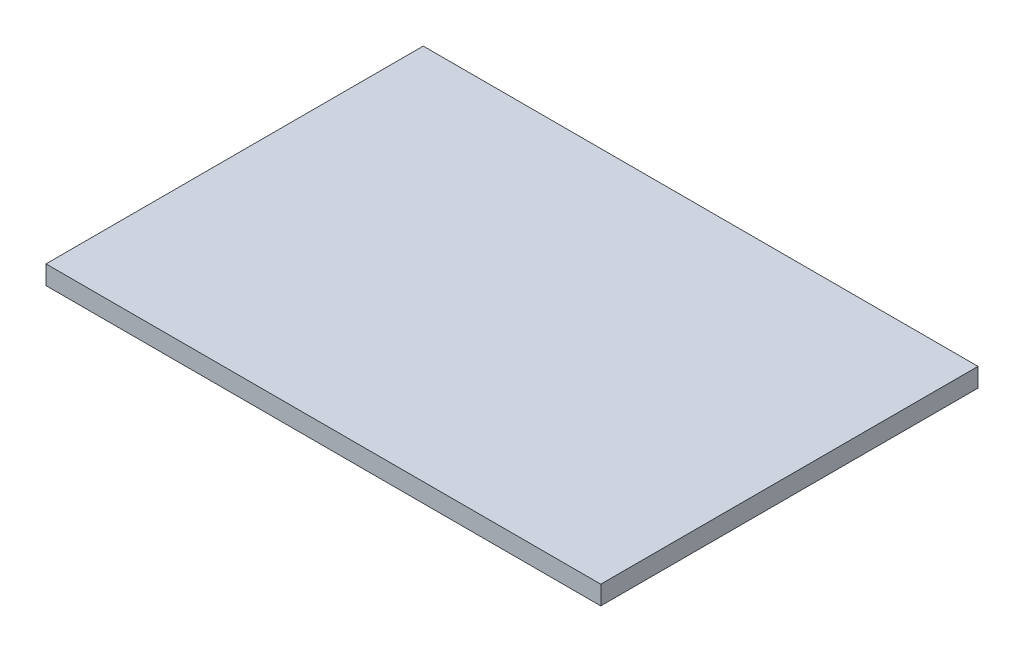
ISO-10303-21;
HEADER;
FILE_DESCRIPTION(('STEP AP214'),'2;1');
FILE_NAME('part.step','',(''),(''),'','','');
FILE_SCHEMA(('AUTOMOTIVE_DESIGN { 1 0 10303 214 1 1 1 1 }'));
ENDSEC;
DATA;
#1=APPLICATION_CONTEXT('core data for automotive mechanical design processes');
#2=APPLICATION_PROTOCOL_DEFINITION('international standard','automotive_design',2000,#1);
#3=PRODUCT_CONTEXT('',#1,'mechanical');
#4=PRODUCT('Part','Part','',(#3));
#5=PRODUCT_RELATED_PRODUCT_CATEGORY('part','',(#4));
#6=PRODUCT_DEFINITION_FORMATION('','',#4);
#7=PRODUCT_DEFINITION_CONTEXT('part definition',#1,'design');
#8=PRODUCT_DEFINITION('design','',#6,#7);
#9=PRODUCT_DEFINITION_SHAPE('','',#8);
#10=(LENGTH_UNIT() NAMED_UNIT(*) SI_UNIT(.MILLI.,.METRE.));
#11=(NAMED_UNIT(*) PLANE_ANGLE_UNIT() SI_UNIT($,.RADIAN.));
#12=(NAMED_UNIT(*) SI_UNIT($,.STERADIAN.) SOLID_ANGLE_UNIT());
#13=UNCERTAINTY_MEASURE_WITH_UNIT(LENGTH_MEASURE(1.E-05),#10,'distance_accuracy_value','');
#14=(GEOMETRIC_REPRESENTATION_CONTEXT(3) GLOBAL_UNCERTAINTY_ASSIGNED_CONTEXT((#13)) GLOBAL_UNIT_ASSIGNED_CONTEXT((#10,
#11,#12)) REPRESENTATION_CONTEXT('',''));
#15=CARTESIAN_POINT('',(0.,0.,0.));
#16=DIRECTION('',(0.,0.,1.));
#17=DIRECTION('',(1.,0.,0.));
#18=AXIS2_PLACEMENT_3D('',#15,#16,#17);
#19=CARTESIAN_POINT('',(0.,0.,0.));
#20=DIRECTION('',(0.,1.,0.));
#21=DIRECTION('',(0.,0.,1.));
#22=AXIS2_PLACEMENT_3D('',#19,#20,#21);
#23=PLANE('',#22);
#24=DIRECTION('',(-1.,0.,0.));
#25=VECTOR('',#24,1.);
#26=CARTESIAN_POINT('',(-25.,0.,17.));
#27=LINE('',#26,#25);
#28=CARTESIAN_POINT('',(25.,0.,17.));
#29=VERTEX_POINT('',#28);
#30=CARTESIAN_POINT('',(-25.,0.,17.));
#31=VERTEX_POINT('',#30);
#32=EDGE_CURVE('P0_E81',#29,#31,#27,.T.);
#33=ORIENTED_EDGE('',*,*,#32,.T.);
#34=DIRECTION('',(0.,0.,-1.));
#35=VECTOR('',#34,1.);
#36=CARTESIAN_POINT('',(-25.,0.,-17.));
#37=LINE('',#36,#35);
#38=CARTESIAN_POINT('',(-25.,0.,-17.));
#39=VERTEX_POINT('',#38);
#40=EDGE_CURVE('P0_E68',#31,#39,#37,.T.);
#41=ORIENTED_EDGE('',*,*,#40,.T.);
#42=DIRECTION('',(1.,0.,0.));
#43=VECTOR('',#42,1.);
#44=CARTESIAN_POINT('',(-25.,0.,-17.));
#45=LINE('',#44,#43);
#46=CARTESIAN_POINT('',(25.,0.,-17.));
#47=VERTEX_POINT('',#46);
#48=EDGE_CURVE('P0_E55',#39,#47,#45,.T.);
#49=ORIENTED_EDGE('',*,*,#48,.T.);
#50=DIRECTION('',(0.,0.,1.));
#51=VECTOR('',#50,1.);
#52=CARTESIAN_POINT('',(25.,0.,-17.));
#53=LINE('',#52,#51);
#54=EDGE_CURVE('P0_E20',#47,#29,#53,.T.);
#55=ORIENTED_EDGE('',*,*,#54,.T.);
#56=EDGE_LOOP('',(#33,#41,#49,#55));
#57=FACE_BOUND('',#56,.T.);
#58=ADVANCED_FACE('P0_F17',(#57),#23,.F.);
#59=CARTESIAN_POINT('',(25.,1.7,-17.));
#60=DIRECTION('',(-1.,0.,0.));
#61=DIRECTION('',(0.,0.,1.));
#62=AXIS2_PLACEMENT_3D('',#59,#60,#61);
#63=PLANE('',#62);
#64=DIRECTION('',(0.,1.,0.));
#65=VECTOR('',#64,1.);
#66=CARTESIAN_POINT('',(25.,1.7,-17.));
#67=LINE('',#66,#65);
#68=CARTESIAN_POINT('',(25.,1.7,-17.));
#69=VERTEX_POINT('',#68);
#70=EDGE_CURVE('P0_E61',#47,#69,#67,.T.);
#71=ORIENTED_EDGE('',*,*,#70,.T.);
#72=DIRECTION('',(0.,0.,1.));
#73=VECTOR('',#72,1.);
#74=CARTESIAN_POINT('',(25.,1.7,0.));
#75=LINE('',#74,#73);
#76=CARTESIAN_POINT('',(25.,1.7,17.));
#77=VERTEX_POINT('',#76);
#78=EDGE_CURVE('P0_E83',#77,#69,#75,.F.);
#79=ORIENTED_EDGE('',*,*,#78,.F.);
#80=DIRECTION('',(0.,1.,0.));
#81=VECTOR('',#80,1.);
#82=CARTESIAN_POINT('',(25.,1.7,17.));
#83=LINE('',#82,#81);
#84=EDGE_CURVE('P0_E64',#77,#29,#83,.F.);
#85=ORIENTED_EDGE('',*,*,#84,.T.);
#86=ORIENTED_EDGE('',*,*,#54,.F.);
#87=EDGE_LOOP('',(#71,#79,#85,#86));
#88=FACE_BOUND('',#87,.T.);
#89=ADVANCED_FACE('P0_F60',(#88),#63,.F.);
#90=CARTESIAN_POINT('',(-25.,1.7,-17.));
#91=DIRECTION('',(0.,0.,1.));
#92=DIRECTION('',(1.,0.,0.));
#93=AXIS2_PLACEMENT_3D('',#90,#91,#92);
#94=PLANE('',#93);
#95=DIRECTION('',(0.,1.,0.));
#96=VECTOR('',#95,1.);
#97=CARTESIAN_POINT('',(-25.,1.7,-17.));
#98=LINE('',#97,#96);
#99=CARTESIAN_POINT('',(-25.,1.7,-17.));
#100=VERTEX_POINT('',#99);
#101=EDGE_CURVE('P0_E70',#39,#100,#98,.T.);
#102=ORIENTED_EDGE('',*,*,#101,.T.);
#103=DIRECTION('',(1.,0.,0.));
#104=VECTOR('',#103,1.);
#105=CARTESIAN_POINT('',(0.,1.7,-17.));
#106=LINE('',#105,#104);
#107=EDGE_CURVE('P0_E74',#69,#100,#106,.F.);
#108=ORIENTED_EDGE('',*,*,#107,.F.);
#109=ORIENTED_EDGE('',*,*,#70,.F.);
#110=ORIENTED_EDGE('',*,*,#48,.F.);
#111=EDGE_LOOP('',(#102,#108,#109,#110));
#112=FACE_BOUND('',#111,.T.);
#113=ADVANCED_FACE('P0_F72',(#112),#94,.F.);
#114=CARTESIAN_POINT('',(-25.,1.7,-17.));
#115=DIRECTION('',(1.,0.,0.));
#116=DIRECTION('',(0.,0.,-1.));
#117=AXIS2_PLACEMENT_3D('',#114,#115,#116);
#118=PLANE('',#117);
#119=DIRECTION('',(0.,1.,0.));
#120=VECTOR('',#119,1.);
#121=CARTESIAN_POINT('',(-25.,1.7,17.));
#122=LINE('',#121,#120);
#123=CARTESIAN_POINT('',(-25.,1.7,17.));
#124=VERTEX_POINT('',#123);
#125=EDGE_CURVE('P0_E35',#31,#124,#122,.T.);
#126=ORIENTED_EDGE('',*,*,#125,.T.);
#127=DIRECTION('',(0.,0.,1.));
#128=VECTOR('',#127,1.);
#129=CARTESIAN_POINT('',(-25.,1.7,0.));
#130=LINE('',#129,#128);
#131=EDGE_CURVE('P0_E26',#100,#124,#130,.T.);
#132=ORIENTED_EDGE('',*,*,#131,.F.);
#133=ORIENTED_EDGE('',*,*,#101,.F.);
#134=ORIENTED_EDGE('',*,*,#40,.F.);
#135=EDGE_LOOP('',(#126,#132,#133,#134));
#136=FACE_BOUND('',#135,.T.);
#137=ADVANCED_FACE('P0_F89',(#136),#118,.F.);
#138=CARTESIAN_POINT('',(-25.,1.7,17.));
#139=DIRECTION('',(0.,0.,-1.));
#140=DIRECTION('',(-1.,0.,0.));
#141=AXIS2_PLACEMENT_3D('',#138,#139,#140);
#142=PLANE('',#141);
#143=ORIENTED_EDGE('',*,*,#84,.F.);
#144=DIRECTION('',(1.,0.,0.));
#145=VECTOR('',#144,1.);
#146=CARTESIAN_POINT('',(0.,1.7,17.));
#147=LINE('',#146,#145);
#148=EDGE_CURVE('P0_E11',#124,#77,#147,.T.);
#149=ORIENTED_EDGE('',*,*,#148,.F.);
#150=ORIENTED_EDGE('',*,*,#125,.F.);
#151=ORIENTED_EDGE('',*,*,#32,.F.);
#152=EDGE_LOOP('',(#143,#149,#150,#151));
#153=FACE_BOUND('',#152,.T.);
#154=ADVANCED_FACE('P0_F91',(#153),#142,.F.);
#155=CARTESIAN_POINT('',(0.,1.7,0.));
#156=DIRECTION('',(0.,1.,0.));
#157=DIRECTION('',(0.,0.,1.));
#158=AXIS2_PLACEMENT_3D('',#155,#156,#157);
#159=PLANE('',#158);
#160=ORIENTED_EDGE('',*,*,#131,.T.);
#161=ORIENTED_EDGE('',*,*,#148,.T.);
#162=ORIENTED_EDGE('',*,*,#78,.T.);
#163=ORIENTED_EDGE('',*,*,#107,.T.);
#164=EDGE_LOOP('',(#160,#161,#162,#163));
#165=FACE_BOUND('',#164,.T.);
#166=ADVANCED_FACE('P0_F88',(#165),#159,.T.);
#167=CLOSED_SHELL('',(#58,#89,#113,#137,#154,#166));
#168=MANIFOLD_SOLID_BREP('P0_B1',#167);
#169=CARTESIAN_POINT('',(0.,0.,0.));
#170=DIRECTION('',(0.,-1.,0.));
#171=DIRECTION('',(0.,0.,-1.));
#172=AXIS2_PLACEMENT_3D('',#169,#170,#171);
#173=PLANE('',#172);
#174=DIRECTION('',(1.,0.,0.));
#175=VECTOR('',#174,1.);
#176=CARTESIAN_POINT('',(21.6,0.,-14.5));
#177=LINE('',#176,#175);
#178=CARTESIAN_POINT('',(21.6,0.,-14.5));
#179=VERTEX_POINT('',#178);
#180=CARTESIAN_POINT('',(7.9,0.,-14.5));
#181=VERTEX_POINT('',#180);
#182=EDGE_CURVE('P1_E81',#179,#181,#177,.F.);
#183=ORIENTED_EDGE('',*,*,#182,.T.);
#184=DIRECTION('',(0.,0.,-1.));
#185=VECTOR('',#184,1.);
#186=CARTESIAN_POINT('',(7.9,0.,-14.5));
#187=LINE('',#186,#185);
#188=CARTESIAN_POINT('',(7.9,0.,-0.500000000000001));
#189=VERTEX_POINT('',#188);
#190=EDGE_CURVE('P1_E68',#181,#189,#187,.F.);
#191=ORIENTED_EDGE('',*,*,#190,.T.);
#192=DIRECTION('',(-1.,0.,0.));
#193=VECTOR('',#192,1.);
#194=CARTESIAN_POINT('',(21.6,0.,-0.5));
#195=LINE('',#194,#193);
#196=CARTESIAN_POINT('',(21.6,0.,-0.5));
#197=VERTEX_POINT('',#196);
#198=EDGE_CURVE('P1_E55',#189,#197,#195,.F.);
#199=ORIENTED_EDGE('',*,*,#198,.T.);
#200=DIRECTION('',(0.,0.,1.));
#201=VECTOR('',#200,1.);
#202=CARTESIAN_POINT('',(21.6,0.,-14.5));
#203=LINE('',#202,#201);
#204=EDGE_CURVE('P1_E20',#197,#179,#203,.F.);
#205=ORIENTED_EDGE('',*,*,#204,.T.);
#206=EDGE_LOOP('',(#183,#191,#199,#205));
#207=FACE_BOUND('',#206,.T.);
#208=ADVANCED_FACE('P1_F17',(#207),#173,.F.);
#209=CARTESIAN_POINT('',(21.6,-2.2,-14.5));
#210=DIRECTION('',(-1.,0.,0.));
#211=DIRECTION('',(0.,0.,1.));
#212=AXIS2_PLACEMENT_3D('',#209,#210,#211);
#213=PLANE('',#212);
#214=DIRECTION('',(0.,1.,0.));
#215=VECTOR('',#214,1.);
#216=CARTESIAN_POINT('',(21.6,-2.2,-0.5));
#217=LINE('',#216,#215);
#218=CARTESIAN_POINT('',(21.6,-2.2,-0.5));
#219=VERTEX_POINT('',#218);
#220=EDGE_CURVE('P1_E61',#197,#219,#217,.F.);
#221=ORIENTED_EDGE('',*,*,#220,.T.);
#222=DIRECTION('',(0.,0.,-1.));
#223=VECTOR('',#222,1.);
#224=CARTESIAN_POINT('',(21.6,-2.2,0.));
#225=LINE('',#224,#223);
#226=CARTESIAN_POINT('',(21.6,-2.2,-14.5));
#227=VERTEX_POINT('',#226);
#228=EDGE_CURVE('P1_E83',#227,#219,#225,.F.);
#229=ORIENTED_EDGE('',*,*,#228,.F.);
#230=DIRECTION('',(0.,1.,0.));
#231=VECTOR('',#230,1.);
#232=CARTESIAN_POINT('',(21.6,-2.2,-14.5));
#233=LINE('',#232,#231);
#234=EDGE_CURVE('P1_E64',#227,#179,#233,.T.);
#235=ORIENTED_EDGE('',*,*,#234,.T.);
#236=ORIENTED_EDGE('',*,*,#204,.F.);
#237=EDGE_LOOP('',(#221,#229,#235,#236));
#238=FACE_BOUND('',#237,.T.);
#239=ADVANCED_FACE('P1_F60',(#238),#213,.F.);
#240=CARTESIAN_POINT('',(21.6,-2.2,-0.5));
#241=DIRECTION('',(0.,0.,-1.));
#242=DIRECTION('',(-1.,0.,0.));
#243=AXIS2_PLACEMENT_3D('',#240,#241,#242);
#244=PLANE('',#243);
#245=DIRECTION('',(0.,1.,0.));
#246=VECTOR('',#245,1.);
#247=CARTESIAN_POINT('',(7.9,-2.2,-0.5));
#248=LINE('',#247,#246);
#249=CARTESIAN_POINT('',(7.9,-2.2,-0.500000000000001));
#250=VERTEX_POINT('',#249);
#251=EDGE_CURVE('P1_E70',#189,#250,#248,.F.);
#252=ORIENTED_EDGE('',*,*,#251,.T.);
#253=DIRECTION('',(1.,0.,0.));
#254=VECTOR('',#253,1.);
#255=CARTESIAN_POINT('',(0.,-2.2,-0.5));
#256=LINE('',#255,#254);
#257=EDGE_CURVE('P1_E74',#219,#250,#256,.F.);
#258=ORIENTED_EDGE('',*,*,#257,.F.);
#259=ORIENTED_EDGE('',*,*,#220,.F.);
#260=ORIENTED_EDGE('',*,*,#198,.F.);
#261=EDGE_LOOP('',(#252,#258,#259,#260));
#262=FACE_BOUND('',#261,.T.);
#263=ADVANCED_FACE('P1_F72',(#262),#244,.F.);
#264=CARTESIAN_POINT('',(7.9,-2.2,-14.5));
#265=DIRECTION('',(1.,0.,0.));
#266=DIRECTION('',(0.,0.,-1.));
#267=AXIS2_PLACEMENT_3D('',#264,#265,#266);
#268=PLANE('',#267);
#269=DIRECTION('',(0.,1.,0.));
#270=VECTOR('',#269,1.);
#271=CARTESIAN_POINT('',(7.9,-2.2,-14.5));
#272=LINE('',#271,#270);
#273=CARTESIAN_POINT('',(7.9,-2.2,-14.5));
#274=VERTEX_POINT('',#273);
#275=EDGE_CURVE('P1_E35',#181,#274,#272,.F.);
#276=ORIENTED_EDGE('',*,*,#275,.T.);
#277=DIRECTION('',(0.,0.,-1.));
#278=VECTOR('',#277,1.);
#279=CARTESIAN_POINT('',(7.9,-2.2,0.));
#280=LINE('',#279,#278);
#281=EDGE_CURVE('P1_E26',#250,#274,#280,.T.);
#282=ORIENTED_EDGE('',*,*,#281,.F.);
#283=ORIENTED_EDGE('',*,*,#251,.F.);
#284=ORIENTED_EDGE('',*,*,#190,.F.);
#285=EDGE_LOOP('',(#276,#282,#283,#284));
#286=FACE_BOUND('',#285,.T.);
#287=ADVANCED_FACE('P1_F89',(#286),#268,.F.);
#288=CARTESIAN_POINT('',(21.6,-2.2,-14.5));
#289=DIRECTION('',(0.,0.,1.));
#290=DIRECTION('',(1.,0.,0.));
#291=AXIS2_PLACEMENT_3D('',#288,#289,#290);
#292=PLANE('',#291);
#293=ORIENTED_EDGE('',*,*,#234,.F.);
#294=DIRECTION('',(1.,0.,0.));
#295=VECTOR('',#294,1.);
#296=CARTESIAN_POINT('',(0.,-2.2,-14.5));
#297=LINE('',#296,#295);
#298=EDGE_CURVE('P1_E11',#274,#227,#297,.T.);
#299=ORIENTED_EDGE('',*,*,#298,.F.);
#300=ORIENTED_EDGE('',*,*,#275,.F.);
#301=ORIENTED_EDGE('',*,*,#182,.F.);
#302=EDGE_LOOP('',(#293,#299,#300,#301));
#303=FACE_BOUND('',#302,.T.);
#304=ADVANCED_FACE('P1_F91',(#303),#292,.F.);
#305=CARTESIAN_POINT('',(0.,-2.2,0.));
#306=DIRECTION('',(0.,-1.,0.));
#307=DIRECTION('',(0.,0.,-1.));
#308=AXIS2_PLACEMENT_3D('',#305,#306,#307);
#309=PLANE('',#308);
#310=ORIENTED_EDGE('',*,*,#281,.T.);
#311=ORIENTED_EDGE('',*,*,#298,.T.);
#312=ORIENTED_EDGE('',*,*,#228,.T.);
#313=ORIENTED_EDGE('',*,*,#257,.T.);
#314=EDGE_LOOP('',(#310,#311,#312,#313));
#315=FACE_BOUND('',#314,.T.);
#316=ADVANCED_FACE('P1_F88',(#315),#309,.T.);
#317=CLOSED_SHELL('',(#208,#239,#263,#287,#304,#316));
#318=MANIFOLD_SOLID_BREP('P1_B1',#317);
#319=ADVANCED_BREP_SHAPE_REPRESENTATION('',(#18,#168,#318),#14);
#320=SHAPE_DEFINITION_REPRESENTATION(#9,#319);
ENDSEC;
END-ISO-10303-21;
